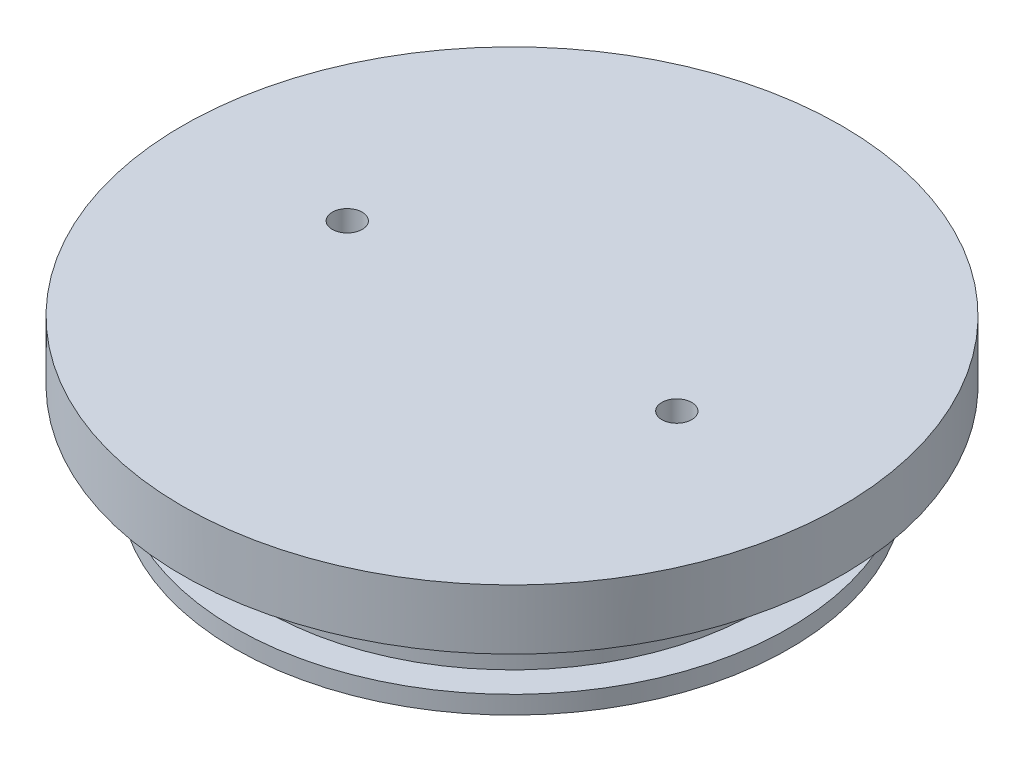
ISO-10303-21;
HEADER;
FILE_DESCRIPTION(('STEP AP214'),'2;1');
FILE_NAME('part.step','',(''),(''),'','','');
FILE_SCHEMA(('AUTOMOTIVE_DESIGN { 1 0 10303 214 1 1 1 1 }'));
ENDSEC;
DATA;
#1=APPLICATION_CONTEXT('core data for automotive mechanical design processes');
#2=APPLICATION_PROTOCOL_DEFINITION('international standard','automotive_design',2000,#1);
#3=PRODUCT_CONTEXT('',#1,'mechanical');
#4=PRODUCT('Part','Part','',(#3));
#5=PRODUCT_RELATED_PRODUCT_CATEGORY('part','',(#4));
#6=PRODUCT_DEFINITION_FORMATION('','',#4);
#7=PRODUCT_DEFINITION_CONTEXT('part definition',#1,'design');
#8=PRODUCT_DEFINITION('design','',#6,#7);
#9=PRODUCT_DEFINITION_SHAPE('','',#8);
#10=(LENGTH_UNIT() NAMED_UNIT(*) SI_UNIT(.MILLI.,.METRE.));
#11=(NAMED_UNIT(*) PLANE_ANGLE_UNIT() SI_UNIT($,.RADIAN.));
#12=(NAMED_UNIT(*) SI_UNIT($,.STERADIAN.) SOLID_ANGLE_UNIT());
#13=UNCERTAINTY_MEASURE_WITH_UNIT(LENGTH_MEASURE(1.E-05),#10,'distance_accuracy_value','');
#14=(GEOMETRIC_REPRESENTATION_CONTEXT(3) GLOBAL_UNCERTAINTY_ASSIGNED_CONTEXT((#13)) GLOBAL_UNIT_ASSIGNED_CONTEXT((#10,
#11,#12)) REPRESENTATION_CONTEXT('',''));
#15=CARTESIAN_POINT('',(0.,0.,0.));
#16=DIRECTION('',(0.,0.,1.));
#17=DIRECTION('',(1.,0.,0.));
#18=AXIS2_PLACEMENT_3D('',#15,#16,#17);
#19=CARTESIAN_POINT('',(5.5,0.,0.));
#20=DIRECTION('',(0.,1.,0.));
#21=DIRECTION('',(0.,0.,1.));
#22=AXIS2_PLACEMENT_3D('',#19,#20,#21);
#23=CYLINDRICAL_SURFACE('',#22,0.500000000000001);
#24=CARTESIAN_POINT('',(5.5,9.,0.));
#25=DIRECTION('',(0.,1.,0.));
#26=DIRECTION('',(0.,0.,1.));
#27=AXIS2_PLACEMENT_3D('',#24,#25,#26);
#28=CIRCLE('',#27,0.500000000000001);
#29=CARTESIAN_POINT('',(5.5,9.,0.500000000000001));
#30=VERTEX_POINT('',#29);
#31=EDGE_CURVE('E116',#30,#30,#28,.T.);
#32=ORIENTED_EDGE('',*,*,#31,.T.);
#33=EDGE_LOOP('',(#32));
#34=FACE_BOUND('',#33,.T.);
#35=CARTESIAN_POINT('',(5.5,7.,0.));
#36=DIRECTION('',(0.,-1.,0.));
#37=DIRECTION('',(0.,0.,-1.));
#38=AXIS2_PLACEMENT_3D('',#35,#36,#37);
#39=CIRCLE('',#38,0.500000000000001);
#40=CARTESIAN_POINT('',(5.5,7.,-0.500000000000001));
#41=VERTEX_POINT('',#40);
#42=EDGE_CURVE('E39',#41,#41,#39,.F.);
#43=ORIENTED_EDGE('',*,*,#42,.F.);
#44=EDGE_LOOP('',(#43));
#45=FACE_BOUND('',#44,.T.);
#46=ADVANCED_FACE('F35',(#34,#45),#23,.F.);
#47=CARTESIAN_POINT('',(-5.5,0.,0.));
#48=DIRECTION('',(0.,1.,0.));
#49=DIRECTION('',(0.,0.,1.));
#50=AXIS2_PLACEMENT_3D('',#47,#48,#49);
#51=CYLINDRICAL_SURFACE('',#50,0.500000000000001);
#52=CARTESIAN_POINT('',(-5.5,9.,0.));
#53=DIRECTION('',(0.,1.,0.));
#54=DIRECTION('',(0.,0.,1.));
#55=AXIS2_PLACEMENT_3D('',#52,#53,#54);
#56=CIRCLE('',#55,0.500000000000001);
#57=CARTESIAN_POINT('',(-5.5,9.,0.500000000000001));
#58=VERTEX_POINT('',#57);
#59=EDGE_CURVE('E113',#58,#58,#56,.T.);
#60=ORIENTED_EDGE('',*,*,#59,.T.);
#61=EDGE_LOOP('',(#60));
#62=FACE_BOUND('',#61,.T.);
#63=CARTESIAN_POINT('',(-5.5,7.,0.));
#64=DIRECTION('',(0.,-1.,0.));
#65=DIRECTION('',(0.,0.,-1.));
#66=AXIS2_PLACEMENT_3D('',#63,#64,#65);
#67=CIRCLE('',#66,0.500000000000001);
#68=CARTESIAN_POINT('',(-5.5,7.,-0.500000000000001));
#69=VERTEX_POINT('',#68);
#70=EDGE_CURVE('E126',#69,#69,#67,.F.);
#71=ORIENTED_EDGE('',*,*,#70,.F.);
#72=EDGE_LOOP('',(#71));
#73=FACE_BOUND('',#72,.T.);
#74=ADVANCED_FACE('F177',(#62,#73),#51,.F.);
#75=CARTESIAN_POINT('',(0.,7.,0.));
#76=DIRECTION('',(0.,-1.,0.));
#77=DIRECTION('',(0.,0.,-1.));
#78=AXIS2_PLACEMENT_3D('',#75,#76,#77);
#79=PLANE('',#78);
#80=DIRECTION('',(0.,0.,1.));
#81=VECTOR('',#80,1.);
#82=CARTESIAN_POINT('',(2.5,7.,3.));
#83=LINE('',#82,#81);
#84=CARTESIAN_POINT('',(2.5,7.,-3.));
#85=VERTEX_POINT('',#84);
#86=CARTESIAN_POINT('',(2.5,7.,3.));
#87=VERTEX_POINT('',#86);
#88=EDGE_CURVE('E88',#85,#87,#83,.T.);
#89=ORIENTED_EDGE('',*,*,#88,.T.);
#90=DIRECTION('',(-1.,0.,0.));
#91=VECTOR('',#90,1.);
#92=CARTESIAN_POINT('',(-2.5,7.,3.));
#93=LINE('',#92,#91);
#94=CARTESIAN_POINT('',(-2.5,7.,3.));
#95=VERTEX_POINT('',#94);
#96=EDGE_CURVE('E156',#87,#95,#93,.T.);
#97=ORIENTED_EDGE('',*,*,#96,.T.);
#98=DIRECTION('',(0.,0.,-1.));
#99=VECTOR('',#98,1.);
#100=CARTESIAN_POINT('',(-2.5,7.,3.));
#101=LINE('',#100,#99);
#102=CARTESIAN_POINT('',(-2.5,7.,-3.));
#103=VERTEX_POINT('',#102);
#104=EDGE_CURVE('E158',#95,#103,#101,.T.);
#105=ORIENTED_EDGE('',*,*,#104,.T.);
#106=DIRECTION('',(1.,0.,0.));
#107=VECTOR('',#106,1.);
#108=CARTESIAN_POINT('',(-2.5,7.,-3.));
#109=LINE('',#108,#107);
#110=EDGE_CURVE('E98',#103,#85,#109,.T.);
#111=ORIENTED_EDGE('',*,*,#110,.T.);
#112=EDGE_LOOP('',(#89,#97,#105,#111));
#113=FACE_BOUND('',#112,.T.);
#114=ADVANCED_FACE('F162',(#113),#79,.T.);
#115=CARTESIAN_POINT('',(2.5,7.,3.));
#116=DIRECTION('',(1.,0.,0.));
#117=DIRECTION('',(0.,0.,-1.));
#118=AXIS2_PLACEMENT_3D('',#115,#116,#117);
#119=PLANE('',#118);
#120=DIRECTION('',(0.,0.,-1.));
#121=VECTOR('',#120,1.);
#122=CARTESIAN_POINT('',(2.5,4.,3.));
#123=LINE('',#122,#121);
#124=CARTESIAN_POINT('',(2.5,4.,3.));
#125=VERTEX_POINT('',#124);
#126=CARTESIAN_POINT('',(2.5,4.,-3.));
#127=VERTEX_POINT('',#126);
#128=EDGE_CURVE('E11',#125,#127,#123,.T.);
#129=ORIENTED_EDGE('',*,*,#128,.F.);
#130=DIRECTION('',(0.,-1.,0.));
#131=VECTOR('',#130,1.);
#132=CARTESIAN_POINT('',(2.5,7.,3.));
#133=LINE('',#132,#131);
#134=EDGE_CURVE('E103',#87,#125,#133,.T.);
#135=ORIENTED_EDGE('',*,*,#134,.F.);
#136=ORIENTED_EDGE('',*,*,#88,.F.);
#137=DIRECTION('',(0.,-1.,0.));
#138=VECTOR('',#137,1.);
#139=CARTESIAN_POINT('',(2.5,7.,-3.));
#140=LINE('',#139,#138);
#141=EDGE_CURVE('E59',#85,#127,#140,.T.);
#142=ORIENTED_EDGE('',*,*,#141,.T.);
#143=EDGE_LOOP('',(#129,#135,#136,#142));
#144=FACE_BOUND('',#143,.T.);
#145=ADVANCED_FACE('F86',(#144),#119,.F.);
#146=CARTESIAN_POINT('',(-2.5,7.,-3.));
#147=DIRECTION('',(0.,0.,-1.));
#148=DIRECTION('',(-1.,0.,0.));
#149=AXIS2_PLACEMENT_3D('',#146,#147,#148);
#150=PLANE('',#149);
#151=DIRECTION('',(-1.,0.,0.));
#152=VECTOR('',#151,1.);
#153=CARTESIAN_POINT('',(-2.5,4.,-3.));
#154=LINE('',#153,#152);
#155=CARTESIAN_POINT('',(-2.5,4.,-3.));
#156=VERTEX_POINT('',#155);
#157=EDGE_CURVE('E77',#127,#156,#154,.T.);
#158=ORIENTED_EDGE('',*,*,#157,.F.);
#159=ORIENTED_EDGE('',*,*,#141,.F.);
#160=ORIENTED_EDGE('',*,*,#110,.F.);
#161=DIRECTION('',(0.,-1.,0.));
#162=VECTOR('',#161,1.);
#163=CARTESIAN_POINT('',(-2.5,7.,-3.));
#164=LINE('',#163,#162);
#165=EDGE_CURVE('E83',#103,#156,#164,.T.);
#166=ORIENTED_EDGE('',*,*,#165,.T.);
#167=EDGE_LOOP('',(#158,#159,#160,#166));
#168=FACE_BOUND('',#167,.T.);
#169=ADVANCED_FACE('F82',(#168),#150,.F.);
#170=CARTESIAN_POINT('',(-2.5,7.,3.));
#171=DIRECTION('',(-1.,0.,0.));
#172=DIRECTION('',(0.,0.,1.));
#173=AXIS2_PLACEMENT_3D('',#170,#171,#172);
#174=PLANE('',#173);
#175=DIRECTION('',(0.,0.,1.));
#176=VECTOR('',#175,1.);
#177=CARTESIAN_POINT('',(-2.5,4.,3.));
#178=LINE('',#177,#176);
#179=CARTESIAN_POINT('',(-2.5,4.,3.));
#180=VERTEX_POINT('',#179);
#181=EDGE_CURVE('E84',#156,#180,#178,.T.);
#182=ORIENTED_EDGE('',*,*,#181,.F.);
#183=ORIENTED_EDGE('',*,*,#165,.F.);
#184=ORIENTED_EDGE('',*,*,#104,.F.);
#185=DIRECTION('',(0.,-1.,0.));
#186=VECTOR('',#185,1.);
#187=CARTESIAN_POINT('',(-2.5,7.,3.));
#188=LINE('',#187,#186);
#189=EDGE_CURVE('E95',#95,#180,#188,.T.);
#190=ORIENTED_EDGE('',*,*,#189,.T.);
#191=EDGE_LOOP('',(#182,#183,#184,#190));
#192=FACE_BOUND('',#191,.T.);
#193=ADVANCED_FACE('F167',(#192),#174,.F.);
#194=CARTESIAN_POINT('',(-2.5,7.,3.));
#195=DIRECTION('',(0.,0.,1.));
#196=DIRECTION('',(1.,0.,0.));
#197=AXIS2_PLACEMENT_3D('',#194,#195,#196);
#198=PLANE('',#197);
#199=DIRECTION('',(1.,0.,0.));
#200=VECTOR('',#199,1.);
#201=CARTESIAN_POINT('',(-2.5,4.,3.));
#202=LINE('',#201,#200);
#203=EDGE_CURVE('E51',#180,#125,#202,.T.);
#204=ORIENTED_EDGE('',*,*,#203,.F.);
#205=ORIENTED_EDGE('',*,*,#189,.F.);
#206=ORIENTED_EDGE('',*,*,#96,.F.);
#207=ORIENTED_EDGE('',*,*,#134,.T.);
#208=EDGE_LOOP('',(#204,#205,#206,#207));
#209=FACE_BOUND('',#208,.T.);
#210=ADVANCED_FACE('F165',(#209),#198,.F.);
#211=CARTESIAN_POINT('',(0.,4.,0.));
#212=DIRECTION('',(0.,-1.,0.));
#213=DIRECTION('',(0.,0.,-1.));
#214=AXIS2_PLACEMENT_3D('',#211,#212,#213);
#215=PLANE('',#214);
#216=CARTESIAN_POINT('',(-2.75,4.,4.765));
#217=DIRECTION('',(0.,-1.,0.));
#218=DIRECTION('',(0.,0.,-1.));
#219=AXIS2_PLACEMENT_3D('',#216,#217,#218);
#220=CIRCLE('',#219,1.25);
#221=CARTESIAN_POINT('',(-2.75,4.,3.515));
#222=VERTEX_POINT('',#221);
#223=EDGE_CURVE('E308',#222,#222,#220,.T.);
#224=ORIENTED_EDGE('',*,*,#223,.F.);
#225=EDGE_LOOP('',(#224));
#226=FACE_BOUND('',#225,.T.);
#227=CARTESIAN_POINT('',(2.75,4.,4.765));
#228=DIRECTION('',(0.,-1.,0.));
#229=DIRECTION('',(0.,0.,-1.));
#230=AXIS2_PLACEMENT_3D('',#227,#228,#229);
#231=CIRCLE('',#230,1.25);
#232=CARTESIAN_POINT('',(2.75,4.,3.515));
#233=VERTEX_POINT('',#232);
#234=EDGE_CURVE('E300',#233,#233,#231,.T.);
#235=ORIENTED_EDGE('',*,*,#234,.F.);
#236=EDGE_LOOP('',(#235));
#237=FACE_BOUND('',#236,.T.);
#238=CARTESIAN_POINT('',(2.75,4.,-4.765));
#239=DIRECTION('',(0.,-1.,0.));
#240=DIRECTION('',(0.,0.,-1.));
#241=AXIS2_PLACEMENT_3D('',#238,#239,#240);
#242=CIRCLE('',#241,1.25);
#243=CARTESIAN_POINT('',(2.75,4.,-6.015));
#244=VERTEX_POINT('',#243);
#245=EDGE_CURVE('E296',#244,#244,#242,.T.);
#246=ORIENTED_EDGE('',*,*,#245,.F.);
#247=EDGE_LOOP('',(#246));
#248=FACE_BOUND('',#247,.T.);
#249=CARTESIAN_POINT('',(-2.75,4.,-4.765));
#250=DIRECTION('',(0.,-1.,0.));
#251=DIRECTION('',(0.,0.,-1.));
#252=AXIS2_PLACEMENT_3D('',#249,#250,#251);
#253=CIRCLE('',#252,1.25);
#254=CARTESIAN_POINT('',(-2.75,4.,-6.015));
#255=VERTEX_POINT('',#254);
#256=EDGE_CURVE('E141',#255,#255,#253,.T.);
#257=ORIENTED_EDGE('',*,*,#256,.F.);
#258=EDGE_LOOP('',(#257));
#259=FACE_BOUND('',#258,.T.);
#260=CARTESIAN_POINT('',(-5.5,4.,0.));
#261=DIRECTION('',(0.,-1.,0.));
#262=DIRECTION('',(0.,0.,-1.));
#263=AXIS2_PLACEMENT_3D('',#260,#261,#262);
#264=CIRCLE('',#263,2.);
#265=CARTESIAN_POINT('',(-5.5,4.,-2.));
#266=VERTEX_POINT('',#265);
#267=EDGE_CURVE('E133',#266,#266,#264,.T.);
#268=ORIENTED_EDGE('',*,*,#267,.F.);
#269=EDGE_LOOP('',(#268));
#270=FACE_BOUND('',#269,.T.);
#271=CARTESIAN_POINT('',(5.5,4.,0.));
#272=DIRECTION('',(0.,-1.,0.));
#273=DIRECTION('',(0.,0.,-1.));
#274=AXIS2_PLACEMENT_3D('',#271,#272,#273);
#275=CIRCLE('',#274,2.);
#276=CARTESIAN_POINT('',(5.5,4.,-2.));
#277=VERTEX_POINT('',#276);
#278=EDGE_CURVE('E146',#277,#277,#275,.T.);
#279=ORIENTED_EDGE('',*,*,#278,.F.);
#280=EDGE_LOOP('',(#279));
#281=FACE_BOUND('',#280,.T.);
#282=CARTESIAN_POINT('',(0.,4.,0.));
#283=DIRECTION('',(0.,-1.,0.));
#284=DIRECTION('',(0.,0.,-1.));
#285=AXIS2_PLACEMENT_3D('',#282,#283,#284);
#286=CIRCLE('',#285,9.25);
#287=CARTESIAN_POINT('',(0.,4.,-9.25));
#288=VERTEX_POINT('',#287);
#289=EDGE_CURVE('E152',#288,#288,#286,.F.);
#290=ORIENTED_EDGE('',*,*,#289,.F.);
#291=EDGE_LOOP('',(#290));
#292=FACE_BOUND('',#291,.T.);
#293=ORIENTED_EDGE('',*,*,#203,.T.);
#294=ORIENTED_EDGE('',*,*,#128,.T.);
#295=ORIENTED_EDGE('',*,*,#157,.T.);
#296=ORIENTED_EDGE('',*,*,#181,.T.);
#297=EDGE_LOOP('',(#293,#294,#295,#296));
#298=FACE_BOUND('',#297,.T.);
#299=ADVANCED_FACE('F76',(#226,#237,#248,#259,#270,#281,#292,#298),#215,.T.);
#300=CARTESIAN_POINT('',(0.,7.,0.));
#301=DIRECTION('',(0.,-1.,0.));
#302=DIRECTION('',(0.,0.,-1.));
#303=AXIS2_PLACEMENT_3D('',#300,#301,#302);
#304=CYLINDRICAL_SURFACE('',#303,9.25);
#305=CARTESIAN_POINT('',(0.,4.6,0.));
#306=DIRECTION('',(0.,1.,0.));
#307=DIRECTION('',(0.,0.,1.));
#308=AXIS2_PLACEMENT_3D('',#305,#306,#307);
#309=CIRCLE('',#308,9.25);
#310=CARTESIAN_POINT('',(0.,4.6,9.25));
#311=VERTEX_POINT('',#310);
#312=EDGE_CURVE('E107',#311,#311,#309,.F.);
#313=ORIENTED_EDGE('',*,*,#312,.T.);
#314=EDGE_LOOP('',(#313));
#315=FACE_BOUND('',#314,.T.);
#316=ORIENTED_EDGE('',*,*,#289,.T.);
#317=EDGE_LOOP('',(#316));
#318=FACE_BOUND('',#317,.T.);
#319=ADVANCED_FACE('F211',(#315,#318),#304,.T.);
#320=CARTESIAN_POINT('',(0.,7.,0.));
#321=DIRECTION('',(0.,-1.,0.));
#322=DIRECTION('',(0.,0.,-1.));
#323=AXIS2_PLACEMENT_3D('',#320,#321,#322);
#324=CIRCLE('',#323,9.25);
#325=CARTESIAN_POINT('',(0.,7.,-9.25));
#326=VERTEX_POINT('',#325);
#327=EDGE_CURVE('E108',#326,#326,#324,.T.);
#328=ORIENTED_EDGE('',*,*,#327,.T.);
#329=EDGE_LOOP('',(#328));
#330=FACE_BOUND('',#329,.T.);
#331=CARTESIAN_POINT('',(0.,6.3,0.));
#332=DIRECTION('',(0.,-1.,0.));
#333=DIRECTION('',(0.,0.,-1.));
#334=AXIS2_PLACEMENT_3D('',#331,#332,#333);
#335=CIRCLE('',#334,9.25);
#336=CARTESIAN_POINT('',(0.,6.3,-9.25));
#337=VERTEX_POINT('',#336);
#338=EDGE_CURVE('E112',#337,#337,#335,.F.);
#339=ORIENTED_EDGE('',*,*,#338,.T.);
#340=EDGE_LOOP('',(#339));
#341=FACE_BOUND('',#340,.T.);
#342=ADVANCED_FACE('F197',(#330,#341),#304,.T.);
#343=CARTESIAN_POINT('',(0.,9.,0.));
#344=DIRECTION('',(0.,-1.,0.));
#345=DIRECTION('',(0.,0.,-1.));
#346=AXIS2_PLACEMENT_3D('',#343,#344,#345);
#347=CYLINDRICAL_SURFACE('',#346,11.);
#348=CARTESIAN_POINT('',(0.,9.,0.));
#349=DIRECTION('',(0.,1.,0.));
#350=DIRECTION('',(0.,0.,1.));
#351=AXIS2_PLACEMENT_3D('',#348,#349,#350);
#352=CIRCLE('',#351,11.);
#353=CARTESIAN_POINT('',(0.,9.,11.));
#354=VERTEX_POINT('',#353);
#355=EDGE_CURVE('E44',#354,#354,#352,.T.);
#356=ORIENTED_EDGE('',*,*,#355,.F.);
#357=EDGE_LOOP('',(#356));
#358=FACE_BOUND('',#357,.T.);
#359=CARTESIAN_POINT('',(0.,7.,0.));
#360=DIRECTION('',(0.,-1.,0.));
#361=DIRECTION('',(0.,0.,-1.));
#362=AXIS2_PLACEMENT_3D('',#359,#360,#361);
#363=CIRCLE('',#362,11.);
#364=CARTESIAN_POINT('',(0.,7.,-11.));
#365=VERTEX_POINT('',#364);
#366=EDGE_CURVE('E111',#365,#365,#363,.T.);
#367=ORIENTED_EDGE('',*,*,#366,.F.);
#368=EDGE_LOOP('',(#367));
#369=FACE_BOUND('',#368,.T.);
#370=ADVANCED_FACE('F37',(#358,#369),#347,.T.);
#371=CARTESIAN_POINT('',(0.,9.,0.));
#372=DIRECTION('',(0.,1.,0.));
#373=DIRECTION('',(0.,0.,1.));
#374=AXIS2_PLACEMENT_3D('',#371,#372,#373);
#375=PLANE('',#374);
#376=ORIENTED_EDGE('',*,*,#59,.F.);
#377=EDGE_LOOP('',(#376));
#378=FACE_BOUND('',#377,.T.);
#379=ORIENTED_EDGE('',*,*,#31,.F.);
#380=EDGE_LOOP('',(#379));
#381=FACE_BOUND('',#380,.T.);
#382=ORIENTED_EDGE('',*,*,#355,.T.);
#383=EDGE_LOOP('',(#382));
#384=FACE_BOUND('',#383,.T.);
#385=ADVANCED_FACE('F187',(#378,#381,#384),#375,.T.);
#386=CARTESIAN_POINT('',(0.,7.,0.));
#387=DIRECTION('',(0.,-1.,0.));
#388=DIRECTION('',(0.,0.,-1.));
#389=AXIS2_PLACEMENT_3D('',#386,#387,#388);
#390=PLANE('',#389);
#391=ORIENTED_EDGE('',*,*,#327,.F.);
#392=EDGE_LOOP('',(#391));
#393=FACE_BOUND('',#392,.T.);
#394=ORIENTED_EDGE('',*,*,#366,.T.);
#395=EDGE_LOOP('',(#394));
#396=FACE_BOUND('',#395,.T.);
#397=ADVANCED_FACE('F189',(#393,#396),#390,.T.);
#398=CARTESIAN_POINT('',(0.,0.,0.));
#399=DIRECTION('',(0.,-1.,0.));
#400=DIRECTION('',(0.,0.,-1.));
#401=AXIS2_PLACEMENT_3D('',#398,#399,#400);
#402=CYLINDRICAL_SURFACE('',#401,8.25);
#403=CARTESIAN_POINT('',(0.,6.3,0.));
#404=DIRECTION('',(0.,-1.,0.));
#405=DIRECTION('',(0.,0.,-1.));
#406=AXIS2_PLACEMENT_3D('',#403,#404,#405);
#407=CIRCLE('',#406,8.25);
#408=CARTESIAN_POINT('',(0.,6.3,-8.25));
#409=VERTEX_POINT('',#408);
#410=EDGE_CURVE('E93',#409,#409,#407,.T.);
#411=ORIENTED_EDGE('',*,*,#410,.T.);
#412=EDGE_LOOP('',(#411));
#413=FACE_BOUND('',#412,.T.);
#414=CARTESIAN_POINT('',(0.,4.6,0.));
#415=DIRECTION('',(0.,-1.,0.));
#416=DIRECTION('',(0.,0.,-1.));
#417=AXIS2_PLACEMENT_3D('',#414,#415,#416);
#418=CIRCLE('',#417,8.25);
#419=CARTESIAN_POINT('',(0.,4.6,-8.25));
#420=VERTEX_POINT('',#419);
#421=EDGE_CURVE('E90',#420,#420,#418,.T.);
#422=ORIENTED_EDGE('',*,*,#421,.F.);
#423=EDGE_LOOP('',(#422));
#424=FACE_BOUND('',#423,.T.);
#425=ADVANCED_FACE('F195',(#413,#424),#402,.T.);
#426=CARTESIAN_POINT('',(-10.25,6.3,0.));
#427=DIRECTION('',(0.,-1.,0.));
#428=DIRECTION('',(0.,0.,-1.));
#429=AXIS2_PLACEMENT_3D('',#426,#427,#428);
#430=PLANE('',#429);
#431=ORIENTED_EDGE('',*,*,#338,.F.);
#432=EDGE_LOOP('',(#431));
#433=FACE_BOUND('',#432,.T.);
#434=ORIENTED_EDGE('',*,*,#410,.F.);
#435=EDGE_LOOP('',(#434));
#436=FACE_BOUND('',#435,.T.);
#437=ADVANCED_FACE('F222',(#433,#436),#430,.T.);
#438=CARTESIAN_POINT('',(-10.25,4.6,0.));
#439=DIRECTION('',(0.,1.,0.));
#440=DIRECTION('',(0.,0.,1.));
#441=AXIS2_PLACEMENT_3D('',#438,#439,#440);
#442=PLANE('',#441);
#443=ORIENTED_EDGE('',*,*,#312,.F.);
#444=EDGE_LOOP('',(#443));
#445=FACE_BOUND('',#444,.T.);
#446=ORIENTED_EDGE('',*,*,#421,.T.);
#447=EDGE_LOOP('',(#446));
#448=FACE_BOUND('',#447,.T.);
#449=ADVANCED_FACE('F226',(#445,#448),#442,.T.);
#450=CARTESIAN_POINT('',(-5.5,7.,0.));
#451=DIRECTION('',(0.,-1.,0.));
#452=DIRECTION('',(0.,0.,-1.));
#453=AXIS2_PLACEMENT_3D('',#450,#451,#452);
#454=PLANE('',#453);
#455=CARTESIAN_POINT('',(-5.5,7.,0.));
#456=DIRECTION('',(0.,-1.,0.));
#457=DIRECTION('',(0.,0.,-1.));
#458=AXIS2_PLACEMENT_3D('',#455,#456,#457);
#459=CIRCLE('',#458,2.);
#460=CARTESIAN_POINT('',(-5.5,7.,-2.));
#461=VERTEX_POINT('',#460);
#462=EDGE_CURVE('E128',#461,#461,#459,.T.);
#463=ORIENTED_EDGE('',*,*,#462,.T.);
#464=EDGE_LOOP('',(#463));
#465=FACE_BOUND('',#464,.T.);
#466=ORIENTED_EDGE('',*,*,#70,.T.);
#467=EDGE_LOOP('',(#466));
#468=FACE_BOUND('',#467,.T.);
#469=ADVANCED_FACE('F230',(#465,#468),#454,.T.);
#470=CARTESIAN_POINT('',(-5.5,7.,0.));
#471=DIRECTION('',(0.,-1.,0.));
#472=DIRECTION('',(0.,0.,-1.));
#473=AXIS2_PLACEMENT_3D('',#470,#471,#472);
#474=CYLINDRICAL_SURFACE('',#473,2.);
#475=ORIENTED_EDGE('',*,*,#462,.F.);
#476=EDGE_LOOP('',(#475));
#477=FACE_BOUND('',#476,.T.);
#478=ORIENTED_EDGE('',*,*,#267,.T.);
#479=EDGE_LOOP('',(#478));
#480=FACE_BOUND('',#479,.T.);
#481=ADVANCED_FACE('F251',(#477,#480),#474,.F.);
#482=CARTESIAN_POINT('',(5.5,7.,0.));
#483=DIRECTION('',(0.,-1.,0.));
#484=DIRECTION('',(0.,0.,-1.));
#485=AXIS2_PLACEMENT_3D('',#482,#483,#484);
#486=PLANE('',#485);
#487=CARTESIAN_POINT('',(5.5,7.,0.));
#488=DIRECTION('',(0.,-1.,0.));
#489=DIRECTION('',(0.,0.,-1.));
#490=AXIS2_PLACEMENT_3D('',#487,#488,#489);
#491=CIRCLE('',#490,2.);
#492=CARTESIAN_POINT('',(5.5,7.,-2.));
#493=VERTEX_POINT('',#492);
#494=EDGE_CURVE('E138',#493,#493,#491,.T.);
#495=ORIENTED_EDGE('',*,*,#494,.T.);
#496=EDGE_LOOP('',(#495));
#497=FACE_BOUND('',#496,.T.);
#498=ORIENTED_EDGE('',*,*,#42,.T.);
#499=EDGE_LOOP('',(#498));
#500=FACE_BOUND('',#499,.T.);
#501=ADVANCED_FACE('F247',(#497,#500),#486,.T.);
#502=CARTESIAN_POINT('',(5.5,7.,0.));
#503=DIRECTION('',(0.,-1.,0.));
#504=DIRECTION('',(0.,0.,-1.));
#505=AXIS2_PLACEMENT_3D('',#502,#503,#504);
#506=CYLINDRICAL_SURFACE('',#505,2.);
#507=ORIENTED_EDGE('',*,*,#494,.F.);
#508=EDGE_LOOP('',(#507));
#509=FACE_BOUND('',#508,.T.);
#510=ORIENTED_EDGE('',*,*,#278,.T.);
#511=EDGE_LOOP('',(#510));
#512=FACE_BOUND('',#511,.T.);
#513=ADVANCED_FACE('F243',(#509,#512),#506,.F.);
#514=CARTESIAN_POINT('',(-2.75,7.,-4.765));
#515=DIRECTION('',(0.,-1.,0.));
#516=DIRECTION('',(0.,0.,-1.));
#517=AXIS2_PLACEMENT_3D('',#514,#515,#516);
#518=CYLINDRICAL_SURFACE('',#517,1.25);
#519=CARTESIAN_POINT('',(-2.75,7.,-4.765));
#520=DIRECTION('',(0.,-1.,0.));
#521=DIRECTION('',(0.,0.,-1.));
#522=AXIS2_PLACEMENT_3D('',#519,#520,#521);
#523=CIRCLE('',#522,1.25);
#524=CARTESIAN_POINT('',(-2.75,7.,-6.015));
#525=VERTEX_POINT('',#524);
#526=EDGE_CURVE('E148',#525,#525,#523,.T.);
#527=ORIENTED_EDGE('',*,*,#526,.F.);
#528=EDGE_LOOP('',(#527));
#529=FACE_BOUND('',#528,.T.);
#530=ORIENTED_EDGE('',*,*,#256,.T.);
#531=EDGE_LOOP('',(#530));
#532=FACE_BOUND('',#531,.T.);
#533=ADVANCED_FACE('F246',(#529,#532),#518,.F.);
#534=CARTESIAN_POINT('',(-2.75,7.,-4.765));
#535=DIRECTION('',(0.,-1.,0.));
#536=DIRECTION('',(0.,0.,-1.));
#537=AXIS2_PLACEMENT_3D('',#534,#535,#536);
#538=PLANE('',#537);
#539=ORIENTED_EDGE('',*,*,#526,.T.);
#540=EDGE_LOOP('',(#539));
#541=FACE_BOUND('',#540,.T.);
#542=ADVANCED_FACE('F260',(#541),#538,.T.);
#543=CARTESIAN_POINT('',(2.75,7.,-4.765));
#544=DIRECTION('',(0.,-1.,0.));
#545=DIRECTION('',(0.,0.,-1.));
#546=AXIS2_PLACEMENT_3D('',#543,#544,#545);
#547=CYLINDRICAL_SURFACE('',#546,1.25);
#548=CARTESIAN_POINT('',(2.75,7.,-4.765));
#549=DIRECTION('',(0.,-1.,0.));
#550=DIRECTION('',(0.,0.,-1.));
#551=AXIS2_PLACEMENT_3D('',#548,#549,#550);
#552=CIRCLE('',#551,1.25);
#553=CARTESIAN_POINT('',(2.75,7.,-6.015));
#554=VERTEX_POINT('',#553);
#555=EDGE_CURVE('E293',#554,#554,#552,.T.);
#556=ORIENTED_EDGE('',*,*,#555,.F.);
#557=EDGE_LOOP('',(#556));
#558=FACE_BOUND('',#557,.T.);
#559=ORIENTED_EDGE('',*,*,#245,.T.);
#560=EDGE_LOOP('',(#559));
#561=FACE_BOUND('',#560,.T.);
#562=ADVANCED_FACE('F264',(#558,#561),#547,.F.);
#563=CARTESIAN_POINT('',(2.75,7.,-4.765));
#564=DIRECTION('',(0.,-1.,0.));
#565=DIRECTION('',(0.,0.,-1.));
#566=AXIS2_PLACEMENT_3D('',#563,#564,#565);
#567=PLANE('',#566);
#568=ORIENTED_EDGE('',*,*,#555,.T.);
#569=EDGE_LOOP('',(#568));
#570=FACE_BOUND('',#569,.T.);
#571=ADVANCED_FACE('F281',(#570),#567,.T.);
#572=CARTESIAN_POINT('',(2.75,7.,4.765));
#573=DIRECTION('',(0.,-1.,0.));
#574=DIRECTION('',(0.,0.,-1.));
#575=AXIS2_PLACEMENT_3D('',#572,#573,#574);
#576=CYLINDRICAL_SURFACE('',#575,1.25);
#577=CARTESIAN_POINT('',(2.75,7.,4.765));
#578=DIRECTION('',(0.,-1.,0.));
#579=DIRECTION('',(0.,0.,-1.));
#580=AXIS2_PLACEMENT_3D('',#577,#578,#579);
#581=CIRCLE('',#580,1.25);
#582=CARTESIAN_POINT('',(2.75,7.,3.515));
#583=VERTEX_POINT('',#582);
#584=EDGE_CURVE('E305',#583,#583,#581,.T.);
#585=ORIENTED_EDGE('',*,*,#584,.F.);
#586=EDGE_LOOP('',(#585));
#587=FACE_BOUND('',#586,.T.);
#588=ORIENTED_EDGE('',*,*,#234,.T.);
#589=EDGE_LOOP('',(#588));
#590=FACE_BOUND('',#589,.T.);
#591=ADVANCED_FACE('F277',(#587,#590),#576,.F.);
#592=CARTESIAN_POINT('',(2.75,7.,4.765));
#593=DIRECTION('',(0.,-1.,0.));
#594=DIRECTION('',(0.,0.,-1.));
#595=AXIS2_PLACEMENT_3D('',#592,#593,#594);
#596=PLANE('',#595);
#597=ORIENTED_EDGE('',*,*,#584,.T.);
#598=EDGE_LOOP('',(#597));
#599=FACE_BOUND('',#598,.T.);
#600=ADVANCED_FACE('F273',(#599),#596,.T.);
#601=CARTESIAN_POINT('',(-2.75,7.,4.765));
#602=DIRECTION('',(0.,-1.,0.));
#603=DIRECTION('',(0.,0.,-1.));
#604=AXIS2_PLACEMENT_3D('',#601,#602,#603);
#605=CYLINDRICAL_SURFACE('',#604,1.25);
#606=CARTESIAN_POINT('',(-2.75,7.,4.765));
#607=DIRECTION('',(0.,-1.,0.));
#608=DIRECTION('',(0.,0.,-1.));
#609=AXIS2_PLACEMENT_3D('',#606,#607,#608);
#610=CIRCLE('',#609,1.25);
#611=CARTESIAN_POINT('',(-2.75,7.,3.515));
#612=VERTEX_POINT('',#611);
#613=EDGE_CURVE('E311',#612,#612,#610,.T.);
#614=ORIENTED_EDGE('',*,*,#613,.F.);
#615=EDGE_LOOP('',(#614));
#616=FACE_BOUND('',#615,.T.);
#617=ORIENTED_EDGE('',*,*,#223,.T.);
#618=EDGE_LOOP('',(#617));
#619=FACE_BOUND('',#618,.T.);
#620=ADVANCED_FACE('F269',(#616,#619),#605,.F.);
#621=CARTESIAN_POINT('',(-2.75,7.,4.765));
#622=DIRECTION('',(0.,-1.,0.));
#623=DIRECTION('',(0.,0.,-1.));
#624=AXIS2_PLACEMENT_3D('',#621,#622,#623);
#625=PLANE('',#624);
#626=ORIENTED_EDGE('',*,*,#613,.T.);
#627=EDGE_LOOP('',(#626));
#628=FACE_BOUND('',#627,.T.);
#629=ADVANCED_FACE('F266',(#628),#625,.T.);
#630=CLOSED_SHELL('',(#46,#74,#114,#145,#169,#193,#210,#299,#319,#342,#370,#385,#397,#425,#437,
#449,#469,#481,#501,#513,#533,#542,#562,#571,#591,#600,#620,#629));
#631=MANIFOLD_SOLID_BREP('B2',#630);
#632=ADVANCED_BREP_SHAPE_REPRESENTATION('',(#18,#631),#14);
#633=SHAPE_DEFINITION_REPRESENTATION(#9,#632);
ENDSEC;
END-ISO-10303-21;
